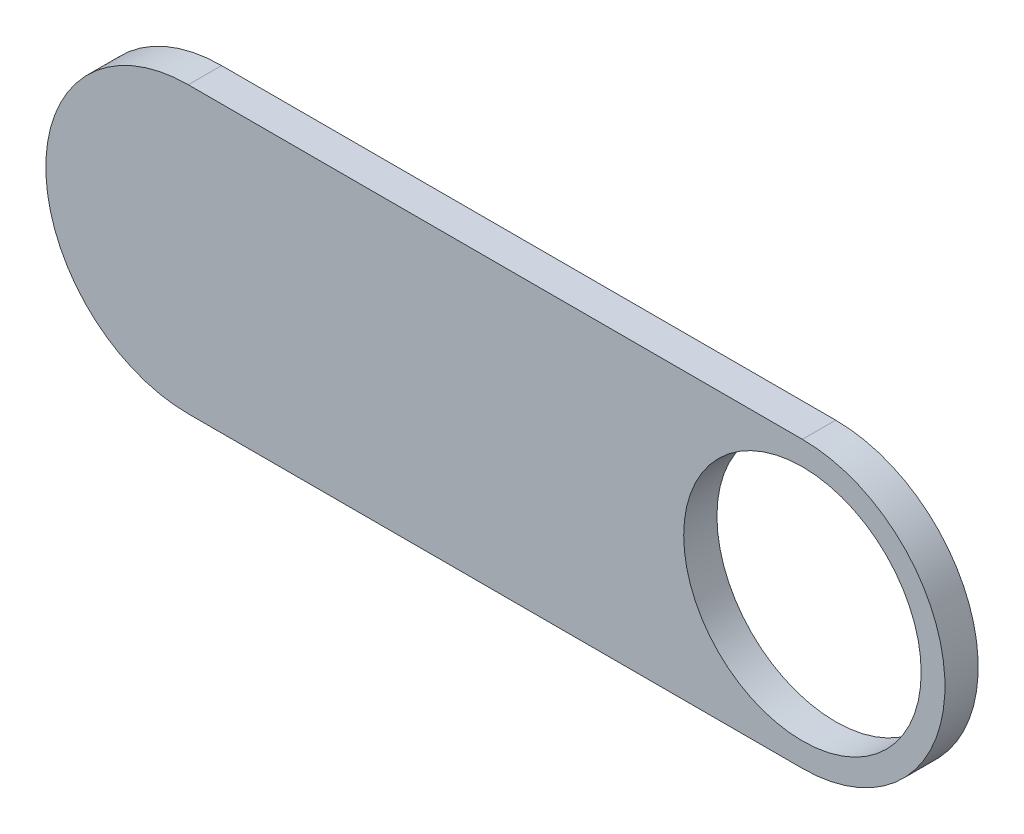
ISO-10303-21;
HEADER;
FILE_DESCRIPTION(('STEP AP214'),'2;1');
FILE_NAME('part.step','',(''),(''),'','','');
FILE_SCHEMA(('AUTOMOTIVE_DESIGN { 1 0 10303 214 1 1 1 1 }'));
ENDSEC;
DATA;
#1=APPLICATION_CONTEXT('core data for automotive mechanical design processes');
#2=APPLICATION_PROTOCOL_DEFINITION('international standard','automotive_design',2000,#1);
#3=PRODUCT_CONTEXT('',#1,'mechanical');
#4=PRODUCT('Part','Part','',(#3));
#5=PRODUCT_RELATED_PRODUCT_CATEGORY('part','',(#4));
#6=PRODUCT_DEFINITION_FORMATION('','',#4);
#7=PRODUCT_DEFINITION_CONTEXT('part definition',#1,'design');
#8=PRODUCT_DEFINITION('design','',#6,#7);
#9=PRODUCT_DEFINITION_SHAPE('','',#8);
#10=(LENGTH_UNIT() NAMED_UNIT(*) SI_UNIT(.MILLI.,.METRE.));
#11=(NAMED_UNIT(*) PLANE_ANGLE_UNIT() SI_UNIT($,.RADIAN.));
#12=(NAMED_UNIT(*) SI_UNIT($,.STERADIAN.) SOLID_ANGLE_UNIT());
#13=UNCERTAINTY_MEASURE_WITH_UNIT(LENGTH_MEASURE(1.E-05),#10,'distance_accuracy_value','');
#14=(GEOMETRIC_REPRESENTATION_CONTEXT(3) GLOBAL_UNCERTAINTY_ASSIGNED_CONTEXT((#13)) GLOBAL_UNIT_ASSIGNED_CONTEXT((#10,
#11,#12)) REPRESENTATION_CONTEXT('',''));
#15=CARTESIAN_POINT('',(0.,0.,0.));
#16=DIRECTION('',(0.,0.,1.));
#17=DIRECTION('',(1.,0.,0.));
#18=AXIS2_PLACEMENT_3D('',#15,#16,#17);
#19=CARTESIAN_POINT('',(95.8,-129.6,-0.045));
#20=DIRECTION('',(0.,0.,-1.));
#21=DIRECTION('',(0.,-1.,0.));
#22=AXIS2_PLACEMENT_3D('',#19,#20,#21);
#23=CYLINDRICAL_SURFACE('',#22,0.125);
#24=CARTESIAN_POINT('',(95.8,-129.6,1.6));
#25=DIRECTION('',(0.,0.,-1.));
#26=DIRECTION('',(0.,-1.,0.));
#27=AXIS2_PLACEMENT_3D('',#24,#25,#26);
#28=CIRCLE('',#27,0.125);
#29=CARTESIAN_POINT('',(95.8,-129.725,1.6));
#30=VERTEX_POINT('',#29);
#31=EDGE_CURVE('E129',#30,#30,#28,.T.);
#32=ORIENTED_EDGE('',*,*,#31,.T.);
#33=DIRECTION('',(0.,0.,1.));
#34=VECTOR('',#33,1.);
#35=CARTESIAN_POINT('',(95.8,-129.725,-0.045));
#36=LINE('',#35,#34);
#37=CARTESIAN_POINT('',(95.8,-129.725,1.635));
#38=VERTEX_POINT('',#37);
#39=EDGE_CURVE('E11',#30,#38,#36,.T.);
#40=ORIENTED_EDGE('',*,*,#39,.T.);
#41=CARTESIAN_POINT('',(95.8,-129.6,1.635));
#42=DIRECTION('',(0.,0.,-1.));
#43=DIRECTION('',(0.,-1.,0.));
#44=AXIS2_PLACEMENT_3D('',#41,#42,#43);
#45=CIRCLE('',#44,0.125);
#46=EDGE_CURVE('E21',#38,#38,#45,.T.);
#47=ORIENTED_EDGE('',*,*,#46,.F.);
#48=ORIENTED_EDGE('',*,*,#39,.F.);
#49=EDGE_LOOP('',(#32,#40,#47,#48));
#50=FACE_BOUND('',#49,.T.);
#51=ADVANCED_FACE('F17',(#50),#23,.F.);
#52=CARTESIAN_POINT('',(95.153553,-129.75,1.6));
#53=DIRECTION('',(0.,1.,0.));
#54=DIRECTION('',(1.,0.,0.));
#55=AXIS2_PLACEMENT_3D('',#52,#53,#54);
#56=PLANE('',#55);
#57=DIRECTION('',(1.,0.,0.));
#58=VECTOR('',#57,1.);
#59=CARTESIAN_POINT('',(95.153553,-129.75,1.6));
#60=LINE('',#59,#58);
#61=CARTESIAN_POINT('',(95.153553,-129.75,1.6));
#62=VERTEX_POINT('',#61);
#63=CARTESIAN_POINT('',(95.8,-129.75,1.6));
#64=VERTEX_POINT('',#63);
#65=EDGE_CURVE('E89',#62,#64,#60,.T.);
#66=ORIENTED_EDGE('',*,*,#65,.T.);
#67=DIRECTION('',(0.,0.,1.));
#68=VECTOR('',#67,1.);
#69=CARTESIAN_POINT('',(95.8,-129.75,1.6));
#70=LINE('',#69,#68);
#71=CARTESIAN_POINT('',(95.8,-129.75,1.635));
#72=VERTEX_POINT('',#71);
#73=EDGE_CURVE('E113',#64,#72,#70,.T.);
#74=ORIENTED_EDGE('',*,*,#73,.T.);
#75=DIRECTION('',(1.,0.,0.));
#76=VECTOR('',#75,1.);
#77=CARTESIAN_POINT('',(95.153553,-129.75,1.635));
#78=LINE('',#77,#76);
#79=CARTESIAN_POINT('',(95.153553,-129.75,1.635));
#80=VERTEX_POINT('',#79);
#81=EDGE_CURVE('E133',#80,#72,#78,.T.);
#82=ORIENTED_EDGE('',*,*,#81,.F.);
#83=DIRECTION('',(0.,0.,1.));
#84=VECTOR('',#83,1.);
#85=CARTESIAN_POINT('',(95.153553,-129.75,1.6));
#86=LINE('',#85,#84);
#87=EDGE_CURVE('E86',#62,#80,#86,.T.);
#88=ORIENTED_EDGE('',*,*,#87,.F.);
#89=EDGE_LOOP('',(#66,#74,#82,#88));
#90=FACE_BOUND('',#89,.T.);
#91=ADVANCED_FACE('F19',(#90),#56,.F.);
#92=CARTESIAN_POINT('',(95.8,-129.45,1.635));
#93=DIRECTION('',(0.,0.,1.));
#94=DIRECTION('',(1.,0.,0.));
#95=AXIS2_PLACEMENT_3D('',#92,#93,#94);
#96=PLANE('',#95);
#97=ORIENTED_EDGE('',*,*,#46,.T.);
#98=EDGE_LOOP('',(#97));
#99=FACE_BOUND('',#98,.T.);
#100=DIRECTION('',(-1.,0.,0.));
#101=VECTOR('',#100,1.);
#102=CARTESIAN_POINT('',(95.8,-129.45,1.635));
#103=LINE('',#102,#101);
#104=CARTESIAN_POINT('',(95.8,-129.45,1.635));
#105=VERTEX_POINT('',#104);
#106=CARTESIAN_POINT('',(95.153553,-129.45,1.635));
#107=VERTEX_POINT('',#106);
#108=EDGE_CURVE('E92',#105,#107,#103,.T.);
#109=ORIENTED_EDGE('',*,*,#108,.T.);
#110=CARTESIAN_POINT('',(95.153553,-129.6,1.635));
#111=DIRECTION('',(0.,0.,1.));
#112=DIRECTION('',(0.,1.,0.));
#113=AXIS2_PLACEMENT_3D('',#110,#111,#112);
#114=CIRCLE('',#113,0.15);
#115=EDGE_CURVE('E78',#107,#80,#114,.T.);
#116=ORIENTED_EDGE('',*,*,#115,.T.);
#117=ORIENTED_EDGE('',*,*,#81,.T.);
#118=CARTESIAN_POINT('',(95.8,-129.6,1.635));
#119=DIRECTION('',(0.,0.,1.));
#120=DIRECTION('',(0.,-1.,0.));
#121=AXIS2_PLACEMENT_3D('',#118,#119,#120);
#122=CIRCLE('',#121,0.15);
#123=EDGE_CURVE('E95',#72,#105,#122,.T.);
#124=ORIENTED_EDGE('',*,*,#123,.T.);
#125=EDGE_LOOP('',(#109,#116,#117,#124));
#126=FACE_BOUND('',#125,.T.);
#127=ADVANCED_FACE('F93',(#99,#126),#96,.T.);
#128=CARTESIAN_POINT('',(95.8,-129.45,1.6));
#129=DIRECTION('',(0.,0.,1.));
#130=DIRECTION('',(1.,0.,0.));
#131=AXIS2_PLACEMENT_3D('',#128,#129,#130);
#132=PLANE('',#131);
#133=ORIENTED_EDGE('',*,*,#31,.F.);
#134=EDGE_LOOP('',(#133));
#135=FACE_BOUND('',#134,.T.);
#136=CARTESIAN_POINT('',(95.8,-129.6,1.6));
#137=DIRECTION('',(0.,0.,1.));
#138=DIRECTION('',(0.,-1.,0.));
#139=AXIS2_PLACEMENT_3D('',#136,#137,#138);
#140=CIRCLE('',#139,0.15);
#141=CARTESIAN_POINT('',(95.8,-129.45,1.6));
#142=VERTEX_POINT('',#141);
#143=EDGE_CURVE('E122',#64,#142,#140,.T.);
#144=ORIENTED_EDGE('',*,*,#143,.F.);
#145=ORIENTED_EDGE('',*,*,#65,.F.);
#146=CARTESIAN_POINT('',(95.153553,-129.6,1.6));
#147=DIRECTION('',(0.,0.,1.));
#148=DIRECTION('',(0.,1.,0.));
#149=AXIS2_PLACEMENT_3D('',#146,#147,#148);
#150=CIRCLE('',#149,0.15);
#151=CARTESIAN_POINT('',(95.153553,-129.45,1.6));
#152=VERTEX_POINT('',#151);
#153=EDGE_CURVE('E116',#152,#62,#150,.T.);
#154=ORIENTED_EDGE('',*,*,#153,.F.);
#155=DIRECTION('',(-1.,0.,0.));
#156=VECTOR('',#155,1.);
#157=CARTESIAN_POINT('',(95.8,-129.45,1.6));
#158=LINE('',#157,#156);
#159=EDGE_CURVE('E104',#142,#152,#158,.T.);
#160=ORIENTED_EDGE('',*,*,#159,.F.);
#161=EDGE_LOOP('',(#144,#145,#154,#160));
#162=FACE_BOUND('',#161,.T.);
#163=ADVANCED_FACE('F159',(#135,#162),#132,.F.);
#164=CARTESIAN_POINT('',(95.153553,-129.6,1.6));
#165=DIRECTION('',(0.,0.,-1.));
#166=DIRECTION('',(0.,1.,0.));
#167=AXIS2_PLACEMENT_3D('',#164,#165,#166);
#168=CYLINDRICAL_SURFACE('',#167,0.15);
#169=ORIENTED_EDGE('',*,*,#153,.T.);
#170=ORIENTED_EDGE('',*,*,#87,.T.);
#171=ORIENTED_EDGE('',*,*,#115,.F.);
#172=DIRECTION('',(0.,0.,1.));
#173=VECTOR('',#172,1.);
#174=CARTESIAN_POINT('',(95.153553,-129.45,1.6));
#175=LINE('',#174,#173);
#176=EDGE_CURVE('E83',#152,#107,#175,.T.);
#177=ORIENTED_EDGE('',*,*,#176,.F.);
#178=EDGE_LOOP('',(#169,#170,#171,#177));
#179=FACE_BOUND('',#178,.T.);
#180=ADVANCED_FACE('F81',(#179),#168,.T.);
#181=CARTESIAN_POINT('',(95.8,-129.6,1.6));
#182=DIRECTION('',(0.,0.,-1.));
#183=DIRECTION('',(0.,-1.,0.));
#184=AXIS2_PLACEMENT_3D('',#181,#182,#183);
#185=CYLINDRICAL_SURFACE('',#184,0.15);
#186=ORIENTED_EDGE('',*,*,#143,.T.);
#187=DIRECTION('',(0.,0.,1.));
#188=VECTOR('',#187,1.);
#189=CARTESIAN_POINT('',(95.8,-129.45,1.6));
#190=LINE('',#189,#188);
#191=EDGE_CURVE('E100',#142,#105,#190,.T.);
#192=ORIENTED_EDGE('',*,*,#191,.T.);
#193=ORIENTED_EDGE('',*,*,#123,.F.);
#194=ORIENTED_EDGE('',*,*,#73,.F.);
#195=EDGE_LOOP('',(#186,#192,#193,#194));
#196=FACE_BOUND('',#195,.T.);
#197=ADVANCED_FACE('F153',(#196),#185,.T.);
#198=CARTESIAN_POINT('',(95.8,-129.45,1.6));
#199=DIRECTION('',(0.,-1.,0.));
#200=DIRECTION('',(0.,0.,-1.));
#201=AXIS2_PLACEMENT_3D('',#198,#199,#200);
#202=PLANE('',#201);
#203=ORIENTED_EDGE('',*,*,#159,.T.);
#204=ORIENTED_EDGE('',*,*,#176,.T.);
#205=ORIENTED_EDGE('',*,*,#108,.F.);
#206=ORIENTED_EDGE('',*,*,#191,.F.);
#207=EDGE_LOOP('',(#203,#204,#205,#206));
#208=FACE_BOUND('',#207,.T.);
#209=ADVANCED_FACE('F102',(#208),#202,.F.);
#210=CLOSED_SHELL('',(#51,#91,#127,#163,#180,#197,#209));
#211=MANIFOLD_SOLID_BREP('B1',#210);
#212=ADVANCED_BREP_SHAPE_REPRESENTATION('',(#18,#211),#14);
#213=SHAPE_DEFINITION_REPRESENTATION(#9,#212);
ENDSEC;
END-ISO-10303-21;
